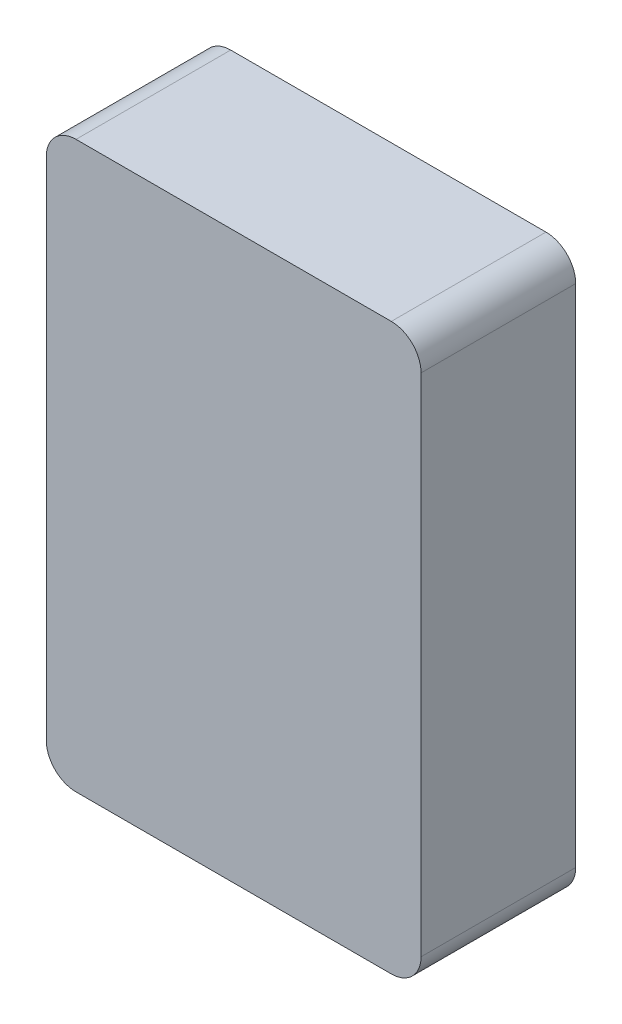
ISO-10303-21;
HEADER;
FILE_DESCRIPTION(('STEP AP214'),'2;1');
FILE_NAME('part.step','',(''),(''),'','','');
FILE_SCHEMA(('AUTOMOTIVE_DESIGN { 1 0 10303 214 1 1 1 1 }'));
ENDSEC;
DATA;
#1=APPLICATION_CONTEXT('core data for automotive mechanical design processes');
#2=APPLICATION_PROTOCOL_DEFINITION('international standard','automotive_design',2000,#1);
#3=PRODUCT_CONTEXT('',#1,'mechanical');
#4=PRODUCT('Part','Part','',(#3));
#5=PRODUCT_RELATED_PRODUCT_CATEGORY('part','',(#4));
#6=PRODUCT_DEFINITION_FORMATION('','',#4);
#7=PRODUCT_DEFINITION_CONTEXT('part definition',#1,'design');
#8=PRODUCT_DEFINITION('design','',#6,#7);
#9=PRODUCT_DEFINITION_SHAPE('','',#8);
#10=(LENGTH_UNIT() NAMED_UNIT(*) SI_UNIT(.MILLI.,.METRE.));
#11=(NAMED_UNIT(*) PLANE_ANGLE_UNIT() SI_UNIT($,.RADIAN.));
#12=(NAMED_UNIT(*) SI_UNIT($,.STERADIAN.) SOLID_ANGLE_UNIT());
#13=UNCERTAINTY_MEASURE_WITH_UNIT(LENGTH_MEASURE(1.E-05),#10,'distance_accuracy_value','');
#14=(GEOMETRIC_REPRESENTATION_CONTEXT(3) GLOBAL_UNCERTAINTY_ASSIGNED_CONTEXT((#13)) GLOBAL_UNIT_ASSIGNED_CONTEXT((#10,
#11,#12)) REPRESENTATION_CONTEXT('',''));
#15=CARTESIAN_POINT('',(0.,0.,0.));
#16=DIRECTION('',(0.,0.,1.));
#17=DIRECTION('',(1.,0.,0.));
#18=AXIS2_PLACEMENT_3D('',#15,#16,#17);
#19=CARTESIAN_POINT('',(31.5,26.4177567453548,26.));
#20=DIRECTION('',(-1.,0.,0.));
#21=DIRECTION('',(0.,-1.,0.));
#22=AXIS2_PLACEMENT_3D('',#19,#20,#21);
#23=PLANE('',#22);
#24=DIRECTION('',(0.,1.,0.));
#25=VECTOR('',#24,1.);
#26=CARTESIAN_POINT('',(31.5,26.4177567453548,0.));
#27=LINE('',#26,#25);
#28=CARTESIAN_POINT('',(31.5,31.4177567453548,0.));
#29=VERTEX_POINT('',#28);
#30=CARTESIAN_POINT('',(31.5,116.417756745355,0.));
#31=VERTEX_POINT('',#30);
#32=EDGE_CURVE('E156',#29,#31,#27,.T.);
#33=ORIENTED_EDGE('',*,*,#32,.T.);
#34=DIRECTION('',(0.,0.,-1.));
#35=VECTOR('',#34,1.);
#36=CARTESIAN_POINT('',(31.5,116.417756745355,26.));
#37=LINE('',#36,#35);
#38=CARTESIAN_POINT('',(31.5,116.417756745355,26.));
#39=VERTEX_POINT('',#38);
#40=EDGE_CURVE('E11',#31,#39,#37,.F.);
#41=ORIENTED_EDGE('',*,*,#40,.T.);
#42=DIRECTION('',(0.,1.,0.));
#43=VECTOR('',#42,1.);
#44=CARTESIAN_POINT('',(31.5,26.4177567453548,26.));
#45=LINE('',#44,#43);
#46=CARTESIAN_POINT('',(31.5,31.4177567453548,26.));
#47=VERTEX_POINT('',#46);
#48=EDGE_CURVE('E124',#47,#39,#45,.T.);
#49=ORIENTED_EDGE('',*,*,#48,.F.);
#50=DIRECTION('',(0.,0.,-1.));
#51=VECTOR('',#50,1.);
#52=CARTESIAN_POINT('',(31.5,31.4177567453548,26.));
#53=LINE('',#52,#51);
#54=EDGE_CURVE('E40',#47,#29,#53,.T.);
#55=ORIENTED_EDGE('',*,*,#54,.T.);
#56=EDGE_LOOP('',(#33,#41,#49,#55));
#57=FACE_BOUND('',#56,.T.);
#58=ADVANCED_FACE('F32',(#57),#23,.F.);
#59=CARTESIAN_POINT('',(-31.5,121.417756745355,26.));
#60=DIRECTION('',(0.,-1.,0.));
#61=DIRECTION('',(0.,0.,-1.));
#62=AXIS2_PLACEMENT_3D('',#59,#60,#61);
#63=PLANE('',#62);
#64=DIRECTION('',(-1.,0.,0.));
#65=VECTOR('',#64,1.);
#66=CARTESIAN_POINT('',(-31.5,121.417756745355,0.));
#67=LINE('',#66,#65);
#68=CARTESIAN_POINT('',(26.5,121.417756745355,0.));
#69=VERTEX_POINT('',#68);
#70=CARTESIAN_POINT('',(-26.5,121.417756745355,0.));
#71=VERTEX_POINT('',#70);
#72=EDGE_CURVE('E129',#69,#71,#67,.T.);
#73=ORIENTED_EDGE('',*,*,#72,.T.);
#74=DIRECTION('',(0.,0.,-1.));
#75=VECTOR('',#74,1.);
#76=CARTESIAN_POINT('',(-26.5,121.417756745355,26.));
#77=LINE('',#76,#75);
#78=CARTESIAN_POINT('',(-26.5,121.417756745355,26.));
#79=VERTEX_POINT('',#78);
#80=EDGE_CURVE('E47',#71,#79,#77,.F.);
#81=ORIENTED_EDGE('',*,*,#80,.T.);
#82=DIRECTION('',(-1.,0.,0.));
#83=VECTOR('',#82,1.);
#84=CARTESIAN_POINT('',(-31.5,121.417756745355,26.));
#85=LINE('',#84,#83);
#86=CARTESIAN_POINT('',(26.5,121.417756745355,26.));
#87=VERTEX_POINT('',#86);
#88=EDGE_CURVE('E127',#87,#79,#85,.T.);
#89=ORIENTED_EDGE('',*,*,#88,.F.);
#90=DIRECTION('',(0.,0.,-1.));
#91=VECTOR('',#90,1.);
#92=CARTESIAN_POINT('',(26.5,121.417756745355,26.));
#93=LINE('',#92,#91);
#94=EDGE_CURVE('E148',#87,#69,#93,.T.);
#95=ORIENTED_EDGE('',*,*,#94,.T.);
#96=EDGE_LOOP('',(#73,#81,#89,#95));
#97=FACE_BOUND('',#96,.T.);
#98=ADVANCED_FACE('F176',(#97),#63,.F.);
#99=CARTESIAN_POINT('',(-31.5,26.4177567453548,26.));
#100=DIRECTION('',(1.,0.,0.));
#101=DIRECTION('',(0.,1.,0.));
#102=AXIS2_PLACEMENT_3D('',#99,#100,#101);
#103=PLANE('',#102);
#104=DIRECTION('',(0.,-1.,0.));
#105=VECTOR('',#104,1.);
#106=CARTESIAN_POINT('',(-31.5,26.4177567453548,0.));
#107=LINE('',#106,#105);
#108=CARTESIAN_POINT('',(-31.5,116.417756745355,0.));
#109=VERTEX_POINT('',#108);
#110=CARTESIAN_POINT('',(-31.5,31.4177567453548,0.));
#111=VERTEX_POINT('',#110);
#112=EDGE_CURVE('E125',#109,#111,#107,.T.);
#113=ORIENTED_EDGE('',*,*,#112,.T.);
#114=DIRECTION('',(0.,0.,-1.));
#115=VECTOR('',#114,1.);
#116=CARTESIAN_POINT('',(-31.5,31.4177567453548,26.));
#117=LINE('',#116,#115);
#118=CARTESIAN_POINT('',(-31.5,31.4177567453548,26.));
#119=VERTEX_POINT('',#118);
#120=EDGE_CURVE('E103',#111,#119,#117,.F.);
#121=ORIENTED_EDGE('',*,*,#120,.T.);
#122=DIRECTION('',(0.,-1.,0.));
#123=VECTOR('',#122,1.);
#124=CARTESIAN_POINT('',(-31.5,26.4177567453548,26.));
#125=LINE('',#124,#123);
#126=CARTESIAN_POINT('',(-31.5,116.417756745355,26.));
#127=VERTEX_POINT('',#126);
#128=EDGE_CURVE('E164',#127,#119,#125,.T.);
#129=ORIENTED_EDGE('',*,*,#128,.F.);
#130=DIRECTION('',(0.,0.,-1.));
#131=VECTOR('',#130,1.);
#132=CARTESIAN_POINT('',(-31.5,116.417756745355,26.));
#133=LINE('',#132,#131);
#134=EDGE_CURVE('E108',#127,#109,#133,.T.);
#135=ORIENTED_EDGE('',*,*,#134,.T.);
#136=EDGE_LOOP('',(#113,#121,#129,#135));
#137=FACE_BOUND('',#136,.T.);
#138=ADVANCED_FACE('F175',(#137),#103,.F.);
#139=CARTESIAN_POINT('',(-31.5,26.4177567453548,26.));
#140=DIRECTION('',(0.,1.,0.));
#141=DIRECTION('',(0.,0.,1.));
#142=AXIS2_PLACEMENT_3D('',#139,#140,#141);
#143=PLANE('',#142);
#144=DIRECTION('',(1.,0.,0.));
#145=VECTOR('',#144,1.);
#146=CARTESIAN_POINT('',(-31.5,26.4177567453548,26.));
#147=LINE('',#146,#145);
#148=CARTESIAN_POINT('',(-26.5,26.4177567453548,26.));
#149=VERTEX_POINT('',#148);
#150=CARTESIAN_POINT('',(26.5,26.4177567453548,26.));
#151=VERTEX_POINT('',#150);
#152=EDGE_CURVE('E118',#149,#151,#147,.T.);
#153=ORIENTED_EDGE('',*,*,#152,.F.);
#154=DIRECTION('',(0.,0.,-1.));
#155=VECTOR('',#154,1.);
#156=CARTESIAN_POINT('',(-26.5,26.4177567453548,26.));
#157=LINE('',#156,#155);
#158=CARTESIAN_POINT('',(-26.5,26.4177567453548,0.));
#159=VERTEX_POINT('',#158);
#160=EDGE_CURVE('E102',#149,#159,#157,.T.);
#161=ORIENTED_EDGE('',*,*,#160,.T.);
#162=DIRECTION('',(1.,0.,0.));
#163=VECTOR('',#162,1.);
#164=CARTESIAN_POINT('',(-31.5,26.4177567453548,0.));
#165=LINE('',#164,#163);
#166=CARTESIAN_POINT('',(26.5,26.4177567453548,0.));
#167=VERTEX_POINT('',#166);
#168=EDGE_CURVE('E115',#159,#167,#165,.T.);
#169=ORIENTED_EDGE('',*,*,#168,.T.);
#170=DIRECTION('',(0.,0.,-1.));
#171=VECTOR('',#170,1.);
#172=CARTESIAN_POINT('',(26.5,26.4177567453548,26.));
#173=LINE('',#172,#171);
#174=EDGE_CURVE('E120',#167,#151,#173,.F.);
#175=ORIENTED_EDGE('',*,*,#174,.T.);
#176=EDGE_LOOP('',(#153,#161,#169,#175));
#177=FACE_BOUND('',#176,.T.);
#178=ADVANCED_FACE('F114',(#177),#143,.F.);
#179=CARTESIAN_POINT('',(0.,0.,26.));
#180=DIRECTION('',(0.,0.,-1.));
#181=DIRECTION('',(-1.,0.,0.));
#182=AXIS2_PLACEMENT_3D('',#179,#180,#181);
#183=PLANE('',#182);
#184=ORIENTED_EDGE('',*,*,#128,.T.);
#185=CARTESIAN_POINT('',(-26.5,31.4177567453548,26.));
#186=DIRECTION('',(0.,0.,-1.));
#187=DIRECTION('',(-1.,0.,0.));
#188=AXIS2_PLACEMENT_3D('',#185,#186,#187);
#189=CIRCLE('',#188,5.);
#190=EDGE_CURVE('E146',#119,#149,#189,.F.);
#191=ORIENTED_EDGE('',*,*,#190,.T.);
#192=ORIENTED_EDGE('',*,*,#152,.T.);
#193=CARTESIAN_POINT('',(26.5,31.4177567453548,26.));
#194=DIRECTION('',(0.,0.,-1.));
#195=DIRECTION('',(-1.,0.,0.));
#196=AXIS2_PLACEMENT_3D('',#193,#194,#195);
#197=CIRCLE('',#196,5.);
#198=EDGE_CURVE('E141',#151,#47,#197,.F.);
#199=ORIENTED_EDGE('',*,*,#198,.T.);
#200=ORIENTED_EDGE('',*,*,#48,.T.);
#201=CARTESIAN_POINT('',(26.5,116.417756745355,26.));
#202=DIRECTION('',(0.,0.,-1.));
#203=DIRECTION('',(-1.,0.,0.));
#204=AXIS2_PLACEMENT_3D('',#201,#202,#203);
#205=CIRCLE('',#204,5.);
#206=EDGE_CURVE('E54',#39,#87,#205,.F.);
#207=ORIENTED_EDGE('',*,*,#206,.T.);
#208=ORIENTED_EDGE('',*,*,#88,.T.);
#209=CARTESIAN_POINT('',(-26.5,116.417756745355,26.));
#210=DIRECTION('',(0.,0.,-1.));
#211=DIRECTION('',(-1.,0.,0.));
#212=AXIS2_PLACEMENT_3D('',#209,#210,#211);
#213=CIRCLE('',#212,5.);
#214=EDGE_CURVE('E144',#79,#127,#213,.F.);
#215=ORIENTED_EDGE('',*,*,#214,.T.);
#216=EDGE_LOOP('',(#184,#191,#192,#199,#200,#207,#208,#215));
#217=FACE_BOUND('',#216,.T.);
#218=ADVANCED_FACE('F168',(#217),#183,.F.);
#219=CARTESIAN_POINT('',(0.,0.,0.));
#220=DIRECTION('',(0.,0.,-1.));
#221=DIRECTION('',(-1.,0.,0.));
#222=AXIS2_PLACEMENT_3D('',#219,#220,#221);
#223=PLANE('',#222);
#224=ORIENTED_EDGE('',*,*,#168,.F.);
#225=CARTESIAN_POINT('',(-26.5,31.4177567453548,0.));
#226=DIRECTION('',(0.,0.,-1.));
#227=DIRECTION('',(-1.,0.,0.));
#228=AXIS2_PLACEMENT_3D('',#225,#226,#227);
#229=CIRCLE('',#228,5.);
#230=EDGE_CURVE('E98',#159,#111,#229,.T.);
#231=ORIENTED_EDGE('',*,*,#230,.T.);
#232=ORIENTED_EDGE('',*,*,#112,.F.);
#233=CARTESIAN_POINT('',(-26.5,116.417756745355,0.));
#234=DIRECTION('',(0.,0.,-1.));
#235=DIRECTION('',(-1.,0.,0.));
#236=AXIS2_PLACEMENT_3D('',#233,#234,#235);
#237=CIRCLE('',#236,5.);
#238=EDGE_CURVE('E109',#109,#71,#237,.T.);
#239=ORIENTED_EDGE('',*,*,#238,.T.);
#240=ORIENTED_EDGE('',*,*,#72,.F.);
#241=CARTESIAN_POINT('',(26.5,116.417756745355,0.));
#242=DIRECTION('',(0.,0.,-1.));
#243=DIRECTION('',(-1.,0.,0.));
#244=AXIS2_PLACEMENT_3D('',#241,#242,#243);
#245=CIRCLE('',#244,5.);
#246=EDGE_CURVE('E135',#69,#31,#245,.T.);
#247=ORIENTED_EDGE('',*,*,#246,.T.);
#248=ORIENTED_EDGE('',*,*,#32,.F.);
#249=CARTESIAN_POINT('',(26.5,31.4177567453548,0.));
#250=DIRECTION('',(0.,0.,-1.));
#251=DIRECTION('',(-1.,0.,0.));
#252=AXIS2_PLACEMENT_3D('',#249,#250,#251);
#253=CIRCLE('',#252,5.);
#254=EDGE_CURVE('E119',#29,#167,#253,.T.);
#255=ORIENTED_EDGE('',*,*,#254,.T.);
#256=EDGE_LOOP('',(#224,#231,#232,#239,#240,#247,#248,#255));
#257=FACE_BOUND('',#256,.T.);
#258=ADVANCED_FACE('F122',(#257),#223,.T.);
#259=CARTESIAN_POINT('',(-26.5,31.4177567453548,26.));
#260=DIRECTION('',(0.,0.,-1.));
#261=DIRECTION('',(-1.,0.,0.));
#262=AXIS2_PLACEMENT_3D('',#259,#260,#261);
#263=CYLINDRICAL_SURFACE('',#262,5.);
#264=ORIENTED_EDGE('',*,*,#190,.F.);
#265=ORIENTED_EDGE('',*,*,#120,.F.);
#266=ORIENTED_EDGE('',*,*,#230,.F.);
#267=ORIENTED_EDGE('',*,*,#160,.F.);
#268=EDGE_LOOP('',(#264,#265,#266,#267));
#269=FACE_BOUND('',#268,.T.);
#270=ADVANCED_FACE('F101',(#269),#263,.T.);
#271=CARTESIAN_POINT('',(-26.5,116.417756745355,26.));
#272=DIRECTION('',(0.,0.,-1.));
#273=DIRECTION('',(-1.,0.,0.));
#274=AXIS2_PLACEMENT_3D('',#271,#272,#273);
#275=CYLINDRICAL_SURFACE('',#274,5.);
#276=ORIENTED_EDGE('',*,*,#214,.F.);
#277=ORIENTED_EDGE('',*,*,#80,.F.);
#278=ORIENTED_EDGE('',*,*,#238,.F.);
#279=ORIENTED_EDGE('',*,*,#134,.F.);
#280=EDGE_LOOP('',(#276,#277,#278,#279));
#281=FACE_BOUND('',#280,.T.);
#282=ADVANCED_FACE('F173',(#281),#275,.T.);
#283=CARTESIAN_POINT('',(26.5,116.417756745355,26.));
#284=DIRECTION('',(0.,0.,-1.));
#285=DIRECTION('',(-1.,0.,0.));
#286=AXIS2_PLACEMENT_3D('',#283,#284,#285);
#287=CYLINDRICAL_SURFACE('',#286,5.);
#288=ORIENTED_EDGE('',*,*,#206,.F.);
#289=ORIENTED_EDGE('',*,*,#40,.F.);
#290=ORIENTED_EDGE('',*,*,#246,.F.);
#291=ORIENTED_EDGE('',*,*,#94,.F.);
#292=EDGE_LOOP('',(#288,#289,#290,#291));
#293=FACE_BOUND('',#292,.T.);
#294=ADVANCED_FACE('F178',(#293),#287,.T.);
#295=CARTESIAN_POINT('',(26.5,31.4177567453548,26.));
#296=DIRECTION('',(0.,0.,-1.));
#297=DIRECTION('',(-1.,0.,0.));
#298=AXIS2_PLACEMENT_3D('',#295,#296,#297);
#299=CYLINDRICAL_SURFACE('',#298,5.);
#300=ORIENTED_EDGE('',*,*,#198,.F.);
#301=ORIENTED_EDGE('',*,*,#174,.F.);
#302=ORIENTED_EDGE('',*,*,#254,.F.);
#303=ORIENTED_EDGE('',*,*,#54,.F.);
#304=EDGE_LOOP('',(#300,#301,#302,#303));
#305=FACE_BOUND('',#304,.T.);
#306=ADVANCED_FACE('F34',(#305),#299,.T.);
#307=CLOSED_SHELL('',(#58,#98,#138,#178,#218,#258,#270,#282,#294,#306));
#308=MANIFOLD_SOLID_BREP('B2',#307);
#309=ADVANCED_BREP_SHAPE_REPRESENTATION('',(#18,#308),#14);
#310=SHAPE_DEFINITION_REPRESENTATION(#9,#309);
ENDSEC;
END-ISO-10303-21;
